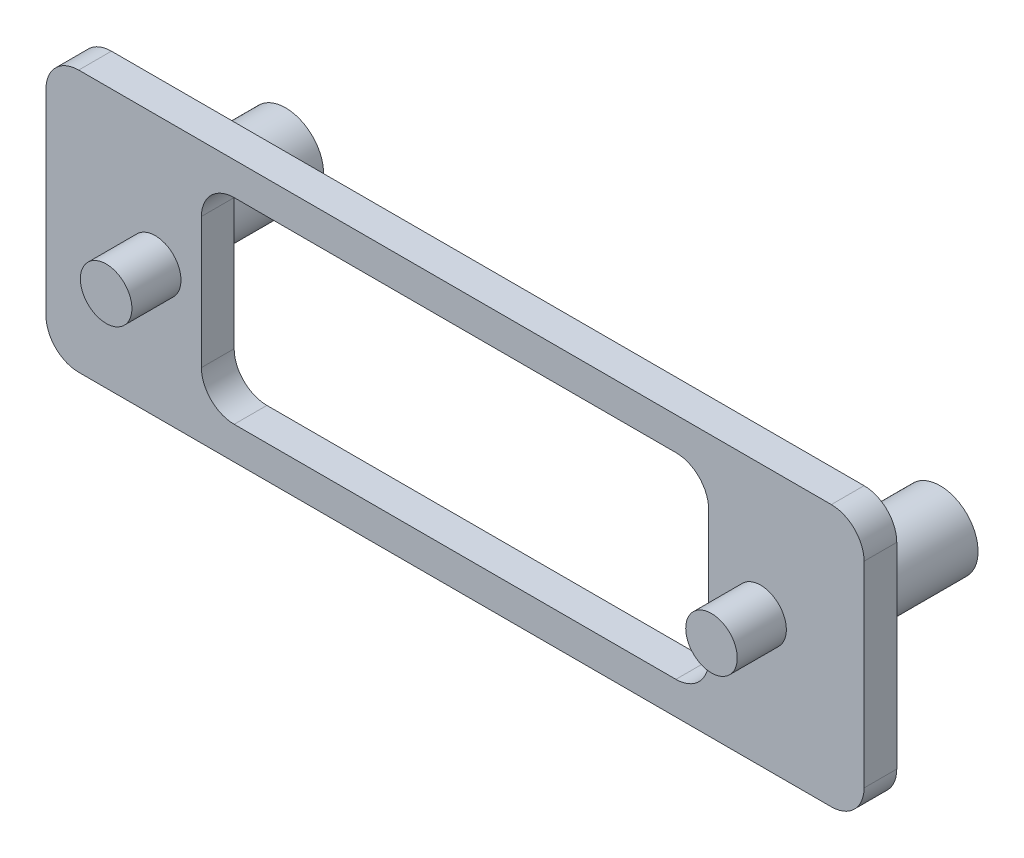
ISO-10303-21;
HEADER;
FILE_DESCRIPTION(('STEP AP214'),'2;1');
FILE_NAME('part.step','',(''),(''),'','','');
FILE_SCHEMA(('AUTOMOTIVE_DESIGN { 1 0 10303 214 1 1 1 1 }'));
ENDSEC;
DATA;
#1=APPLICATION_CONTEXT('core data for automotive mechanical design processes');
#2=APPLICATION_PROTOCOL_DEFINITION('international standard','automotive_design',2000,#1);
#3=PRODUCT_CONTEXT('',#1,'mechanical');
#4=PRODUCT('Part','Part','',(#3));
#5=PRODUCT_RELATED_PRODUCT_CATEGORY('part','',(#4));
#6=PRODUCT_DEFINITION_FORMATION('','',#4);
#7=PRODUCT_DEFINITION_CONTEXT('part definition',#1,'design');
#8=PRODUCT_DEFINITION('design','',#6,#7);
#9=PRODUCT_DEFINITION_SHAPE('','',#8);
#10=(LENGTH_UNIT() NAMED_UNIT(*) SI_UNIT(.MILLI.,.METRE.));
#11=(NAMED_UNIT(*) PLANE_ANGLE_UNIT() SI_UNIT($,.RADIAN.));
#12=(NAMED_UNIT(*) SI_UNIT($,.STERADIAN.) SOLID_ANGLE_UNIT());
#13=UNCERTAINTY_MEASURE_WITH_UNIT(LENGTH_MEASURE(1.E-05),#10,'distance_accuracy_value','');
#14=(GEOMETRIC_REPRESENTATION_CONTEXT(3) GLOBAL_UNCERTAINTY_ASSIGNED_CONTEXT((#13)) GLOBAL_UNIT_ASSIGNED_CONTEXT((#10,
#11,#12)) REPRESENTATION_CONTEXT('',''));
#15=CARTESIAN_POINT('',(0.,0.,0.));
#16=DIRECTION('',(0.,0.,1.));
#17=DIRECTION('',(1.,0.,0.));
#18=AXIS2_PLACEMENT_3D('',#15,#16,#17);
#19=CARTESIAN_POINT('',(0.,0.,2.));
#20=DIRECTION('',(1.,0.,0.));
#21=DIRECTION('',(0.,1.,0.));
#22=AXIS2_PLACEMENT_3D('',#19,#20,#21);
#23=PLANE('',#22);
#24=DIRECTION('',(0.,-1.,0.));
#25=VECTOR('',#24,1.);
#26=CARTESIAN_POINT('',(0.,0.,0.));
#27=LINE('',#26,#25);
#28=CARTESIAN_POINT('',(0.,14.,0.));
#29=VERTEX_POINT('',#28);
#30=CARTESIAN_POINT('',(0.,2.,0.));
#31=VERTEX_POINT('',#30);
#32=EDGE_CURVE('E385',#29,#31,#27,.T.);
#33=ORIENTED_EDGE('',*,*,#32,.T.);
#34=DIRECTION('',(0.,0.,-1.));
#35=VECTOR('',#34,1.);
#36=CARTESIAN_POINT('',(0.,2.,2.));
#37=LINE('',#36,#35);
#38=CARTESIAN_POINT('',(0.,2.,2.));
#39=VERTEX_POINT('',#38);
#40=EDGE_CURVE('E207',#31,#39,#37,.F.);
#41=ORIENTED_EDGE('',*,*,#40,.T.);
#42=DIRECTION('',(0.,-1.,0.));
#43=VECTOR('',#42,1.);
#44=CARTESIAN_POINT('',(0.,0.,2.));
#45=LINE('',#44,#43);
#46=CARTESIAN_POINT('',(0.,14.,2.));
#47=VERTEX_POINT('',#46);
#48=EDGE_CURVE('E242',#47,#39,#45,.T.);
#49=ORIENTED_EDGE('',*,*,#48,.F.);
#50=DIRECTION('',(0.,0.,-1.));
#51=VECTOR('',#50,1.);
#52=CARTESIAN_POINT('',(0.,14.,2.));
#53=LINE('',#52,#51);
#54=EDGE_CURVE('E204',#47,#29,#53,.T.);
#55=ORIENTED_EDGE('',*,*,#54,.T.);
#56=EDGE_LOOP('',(#33,#41,#49,#55));
#57=FACE_BOUND('',#56,.T.);
#58=ADVANCED_FACE('F32',(#57),#23,.F.);
#59=CARTESIAN_POINT('',(0.,0.,2.));
#60=DIRECTION('',(0.,1.,0.));
#61=DIRECTION('',(0.,0.,1.));
#62=AXIS2_PLACEMENT_3D('',#59,#60,#61);
#63=PLANE('',#62);
#64=DIRECTION('',(1.,0.,0.));
#65=VECTOR('',#64,1.);
#66=CARTESIAN_POINT('',(0.,0.,2.));
#67=LINE('',#66,#65);
#68=CARTESIAN_POINT('',(2.,0.,2.));
#69=VERTEX_POINT('',#68);
#70=CARTESIAN_POINT('',(48.,0.,2.));
#71=VERTEX_POINT('',#70);
#72=EDGE_CURVE('E234',#69,#71,#67,.T.);
#73=ORIENTED_EDGE('',*,*,#72,.F.);
#74=DIRECTION('',(0.,0.,-1.));
#75=VECTOR('',#74,1.);
#76=CARTESIAN_POINT('',(2.,0.,2.));
#77=LINE('',#76,#75);
#78=CARTESIAN_POINT('',(2.,0.,0.));
#79=VERTEX_POINT('',#78);
#80=EDGE_CURVE('E193',#69,#79,#77,.T.);
#81=ORIENTED_EDGE('',*,*,#80,.T.);
#82=DIRECTION('',(1.,0.,0.));
#83=VECTOR('',#82,1.);
#84=CARTESIAN_POINT('',(0.,0.,0.));
#85=LINE('',#84,#83);
#86=CARTESIAN_POINT('',(48.,0.,0.));
#87=VERTEX_POINT('',#86);
#88=EDGE_CURVE('E245',#79,#87,#85,.T.);
#89=ORIENTED_EDGE('',*,*,#88,.T.);
#90=DIRECTION('',(0.,0.,-1.));
#91=VECTOR('',#90,1.);
#92=CARTESIAN_POINT('',(48.,0.,2.));
#93=LINE('',#92,#91);
#94=EDGE_CURVE('E191',#87,#71,#93,.F.);
#95=ORIENTED_EDGE('',*,*,#94,.T.);
#96=EDGE_LOOP('',(#73,#81,#89,#95));
#97=FACE_BOUND('',#96,.T.);
#98=ADVANCED_FACE('F299',(#97),#63,.F.);
#99=CARTESIAN_POINT('',(50.,0.,2.));
#100=DIRECTION('',(-1.,0.,0.));
#101=DIRECTION('',(0.,-1.,0.));
#102=AXIS2_PLACEMENT_3D('',#99,#100,#101);
#103=PLANE('',#102);
#104=DIRECTION('',(0.,1.,0.));
#105=VECTOR('',#104,1.);
#106=CARTESIAN_POINT('',(50.,0.,2.));
#107=LINE('',#106,#105);
#108=CARTESIAN_POINT('',(50.,2.,2.));
#109=VERTEX_POINT('',#108);
#110=CARTESIAN_POINT('',(50.,14.,2.));
#111=VERTEX_POINT('',#110);
#112=EDGE_CURVE('E224',#109,#111,#107,.T.);
#113=ORIENTED_EDGE('',*,*,#112,.F.);
#114=DIRECTION('',(0.,0.,-1.));
#115=VECTOR('',#114,1.);
#116=CARTESIAN_POINT('',(50.,2.,2.));
#117=LINE('',#116,#115);
#118=CARTESIAN_POINT('',(50.,2.,0.));
#119=VERTEX_POINT('',#118);
#120=EDGE_CURVE('E11',#109,#119,#117,.T.);
#121=ORIENTED_EDGE('',*,*,#120,.T.);
#122=DIRECTION('',(0.,1.,0.));
#123=VECTOR('',#122,1.);
#124=CARTESIAN_POINT('',(50.,0.,0.));
#125=LINE('',#124,#123);
#126=CARTESIAN_POINT('',(50.,14.,0.));
#127=VERTEX_POINT('',#126);
#128=EDGE_CURVE('E227',#119,#127,#125,.T.);
#129=ORIENTED_EDGE('',*,*,#128,.T.);
#130=DIRECTION('',(0.,0.,-1.));
#131=VECTOR('',#130,1.);
#132=CARTESIAN_POINT('',(50.,14.,2.));
#133=LINE('',#132,#131);
#134=EDGE_CURVE('E40',#127,#111,#133,.F.);
#135=ORIENTED_EDGE('',*,*,#134,.T.);
#136=EDGE_LOOP('',(#113,#121,#129,#135));
#137=FACE_BOUND('',#136,.T.);
#138=ADVANCED_FACE('F223',(#137),#103,.F.);
#139=CARTESIAN_POINT('',(0.,16.,2.));
#140=DIRECTION('',(0.,-1.,0.));
#141=DIRECTION('',(0.,0.,-1.));
#142=AXIS2_PLACEMENT_3D('',#139,#140,#141);
#143=PLANE('',#142);
#144=DIRECTION('',(-1.,0.,0.));
#145=VECTOR('',#144,1.);
#146=CARTESIAN_POINT('',(0.,16.,0.));
#147=LINE('',#146,#145);
#148=CARTESIAN_POINT('',(48.,16.,0.));
#149=VERTEX_POINT('',#148);
#150=CARTESIAN_POINT('',(2.00000000000001,16.,0.));
#151=VERTEX_POINT('',#150);
#152=EDGE_CURVE('E239',#149,#151,#147,.T.);
#153=ORIENTED_EDGE('',*,*,#152,.T.);
#154=DIRECTION('',(0.,0.,-1.));
#155=VECTOR('',#154,1.);
#156=CARTESIAN_POINT('',(2.00000000000001,16.,2.));
#157=LINE('',#156,#155);
#158=CARTESIAN_POINT('',(2.00000000000001,16.,2.));
#159=VERTEX_POINT('',#158);
#160=EDGE_CURVE('E47',#151,#159,#157,.F.);
#161=ORIENTED_EDGE('',*,*,#160,.T.);
#162=DIRECTION('',(-1.,0.,0.));
#163=VECTOR('',#162,1.);
#164=CARTESIAN_POINT('',(0.,16.,2.));
#165=LINE('',#164,#163);
#166=CARTESIAN_POINT('',(48.,16.,2.));
#167=VERTEX_POINT('',#166);
#168=EDGE_CURVE('E233',#167,#159,#165,.T.);
#169=ORIENTED_EDGE('',*,*,#168,.F.);
#170=DIRECTION('',(0.,0.,-1.));
#171=VECTOR('',#170,1.);
#172=CARTESIAN_POINT('',(48.,16.,2.));
#173=LINE('',#172,#171);
#174=EDGE_CURVE('E216',#167,#149,#173,.T.);
#175=ORIENTED_EDGE('',*,*,#174,.T.);
#176=EDGE_LOOP('',(#153,#161,#169,#175));
#177=FACE_BOUND('',#176,.T.);
#178=ADVANCED_FACE('F238',(#177),#143,.F.);
#179=CARTESIAN_POINT('',(0.,0.,2.));
#180=DIRECTION('',(0.,0.,-1.));
#181=DIRECTION('',(-1.,0.,0.));
#182=AXIS2_PLACEMENT_3D('',#179,#180,#181);
#183=PLANE('',#182);
#184=DIRECTION('',(1.,0.,0.));
#185=VECTOR('',#184,1.);
#186=CARTESIAN_POINT('',(9.50000000000001,2.,2.));
#187=LINE('',#186,#185);
#188=CARTESIAN_POINT('',(11.5,2.,2.));
#189=VERTEX_POINT('',#188);
#190=CARTESIAN_POINT('',(38.5,2.,2.));
#191=VERTEX_POINT('',#190);
#192=EDGE_CURVE('E279',#189,#191,#187,.T.);
#193=ORIENTED_EDGE('',*,*,#192,.F.);
#194=CARTESIAN_POINT('',(11.5,4.,2.));
#195=DIRECTION('',(0.,0.,-1.));
#196=DIRECTION('',(-1.,0.,0.));
#197=AXIS2_PLACEMENT_3D('',#194,#195,#196);
#198=CIRCLE('',#197,2.);
#199=CARTESIAN_POINT('',(9.50000000000001,4.,2.));
#200=VERTEX_POINT('',#199);
#201=EDGE_CURVE('E178',#189,#200,#198,.T.);
#202=ORIENTED_EDGE('',*,*,#201,.T.);
#203=DIRECTION('',(0.,-1.,0.));
#204=VECTOR('',#203,1.);
#205=CARTESIAN_POINT('',(9.50000000000001,2.,2.));
#206=LINE('',#205,#204);
#207=CARTESIAN_POINT('',(9.50000000000001,12.,2.));
#208=VERTEX_POINT('',#207);
#209=EDGE_CURVE('E285',#208,#200,#206,.T.);
#210=ORIENTED_EDGE('',*,*,#209,.F.);
#211=CARTESIAN_POINT('',(11.5,12.,2.));
#212=DIRECTION('',(0.,0.,-1.));
#213=DIRECTION('',(-1.,0.,0.));
#214=AXIS2_PLACEMENT_3D('',#211,#212,#213);
#215=CIRCLE('',#214,2.);
#216=CARTESIAN_POINT('',(11.5,14.,2.));
#217=VERTEX_POINT('',#216);
#218=EDGE_CURVE('E187',#208,#217,#215,.T.);
#219=ORIENTED_EDGE('',*,*,#218,.T.);
#220=DIRECTION('',(-1.,0.,0.));
#221=VECTOR('',#220,1.);
#222=CARTESIAN_POINT('',(9.50000000000001,14.,2.));
#223=LINE('',#222,#221);
#224=CARTESIAN_POINT('',(38.5,14.,2.));
#225=VERTEX_POINT('',#224);
#226=EDGE_CURVE('E377',#225,#217,#223,.T.);
#227=ORIENTED_EDGE('',*,*,#226,.F.);
#228=CARTESIAN_POINT('',(38.5,12.,2.));
#229=DIRECTION('',(0.,0.,-1.));
#230=DIRECTION('',(-1.,0.,0.));
#231=AXIS2_PLACEMENT_3D('',#228,#229,#230);
#232=CIRCLE('',#231,2.);
#233=CARTESIAN_POINT('',(40.5,12.,2.));
#234=VERTEX_POINT('',#233);
#235=EDGE_CURVE('E179',#225,#234,#232,.T.);
#236=ORIENTED_EDGE('',*,*,#235,.T.);
#237=DIRECTION('',(0.,1.,0.));
#238=VECTOR('',#237,1.);
#239=CARTESIAN_POINT('',(40.5,2.,2.));
#240=LINE('',#239,#238);
#241=CARTESIAN_POINT('',(40.5,4.,2.));
#242=VERTEX_POINT('',#241);
#243=EDGE_CURVE('E155',#242,#234,#240,.T.);
#244=ORIENTED_EDGE('',*,*,#243,.F.);
#245=CARTESIAN_POINT('',(38.5,4.,2.));
#246=DIRECTION('',(0.,0.,-1.));
#247=DIRECTION('',(-1.,0.,0.));
#248=AXIS2_PLACEMENT_3D('',#245,#246,#247);
#249=CIRCLE('',#248,2.);
#250=EDGE_CURVE('E274',#242,#191,#249,.T.);
#251=ORIENTED_EDGE('',*,*,#250,.T.);
#252=EDGE_LOOP('',(#193,#202,#210,#219,#227,#236,#244,#251));
#253=FACE_BOUND('',#252,.T.);
#254=CARTESIAN_POINT('',(43.675,8.,2.));
#255=DIRECTION('',(0.,0.,-1.));
#256=DIRECTION('',(-1.,0.,0.));
#257=AXIS2_PLACEMENT_3D('',#254,#255,#256);
#258=CIRCLE('',#257,1.575);
#259=CARTESIAN_POINT('',(42.1,8.,2.));
#260=VERTEX_POINT('',#259);
#261=EDGE_CURVE('E252',#260,#260,#258,.F.);
#262=ORIENTED_EDGE('',*,*,#261,.F.);
#263=EDGE_LOOP('',(#262));
#264=FACE_BOUND('',#263,.T.);
#265=CARTESIAN_POINT('',(6.67500000000001,8.,2.));
#266=DIRECTION('',(0.,0.,-1.));
#267=DIRECTION('',(-1.,0.,0.));
#268=AXIS2_PLACEMENT_3D('',#265,#266,#267);
#269=CIRCLE('',#268,1.575);
#270=CARTESIAN_POINT('',(5.10000000000001,8.,2.));
#271=VERTEX_POINT('',#270);
#272=EDGE_CURVE('E249',#271,#271,#269,.F.);
#273=ORIENTED_EDGE('',*,*,#272,.F.);
#274=EDGE_LOOP('',(#273));
#275=FACE_BOUND('',#274,.T.);
#276=ORIENTED_EDGE('',*,*,#48,.T.);
#277=CARTESIAN_POINT('',(2.,2.,2.));
#278=DIRECTION('',(0.,0.,-1.));
#279=DIRECTION('',(-1.,0.,0.));
#280=AXIS2_PLACEMENT_3D('',#277,#278,#279);
#281=CIRCLE('',#280,2.);
#282=EDGE_CURVE('E214',#39,#69,#281,.F.);
#283=ORIENTED_EDGE('',*,*,#282,.T.);
#284=ORIENTED_EDGE('',*,*,#72,.T.);
#285=CARTESIAN_POINT('',(48.,2.,2.));
#286=DIRECTION('',(0.,0.,-1.));
#287=DIRECTION('',(-1.,0.,0.));
#288=AXIS2_PLACEMENT_3D('',#285,#286,#287);
#289=CIRCLE('',#288,2.);
#290=EDGE_CURVE('E210',#71,#109,#289,.F.);
#291=ORIENTED_EDGE('',*,*,#290,.T.);
#292=ORIENTED_EDGE('',*,*,#112,.T.);
#293=CARTESIAN_POINT('',(48.,14.,2.));
#294=DIRECTION('',(0.,0.,-1.));
#295=DIRECTION('',(-1.,0.,0.));
#296=AXIS2_PLACEMENT_3D('',#293,#294,#295);
#297=CIRCLE('',#296,2.);
#298=EDGE_CURVE('E54',#111,#167,#297,.F.);
#299=ORIENTED_EDGE('',*,*,#298,.T.);
#300=ORIENTED_EDGE('',*,*,#168,.T.);
#301=CARTESIAN_POINT('',(2.00000000000001,14.,2.));
#302=DIRECTION('',(0.,0.,-1.));
#303=DIRECTION('',(-1.,0.,0.));
#304=AXIS2_PLACEMENT_3D('',#301,#302,#303);
#305=CIRCLE('',#304,2.);
#306=EDGE_CURVE('E212',#159,#47,#305,.F.);
#307=ORIENTED_EDGE('',*,*,#306,.T.);
#308=EDGE_LOOP('',(#276,#283,#284,#291,#292,#299,#300,#307));
#309=FACE_BOUND('',#308,.T.);
#310=ADVANCED_FACE('F230',(#253,#264,#275,#309),#183,.F.);
#311=CARTESIAN_POINT('',(0.,0.,0.));
#312=DIRECTION('',(0.,0.,-1.));
#313=DIRECTION('',(-1.,0.,0.));
#314=AXIS2_PLACEMENT_3D('',#311,#312,#313);
#315=PLANE('',#314);
#316=CARTESIAN_POINT('',(4.64358902270783,8.,0.));
#317=DIRECTION('',(0.,0.,-1.));
#318=DIRECTION('',(-1.,0.,0.));
#319=AXIS2_PLACEMENT_3D('',#316,#317,#318);
#320=CIRCLE('',#319,2.325);
#321=CARTESIAN_POINT('',(2.31858902270783,8.,0.));
#322=VERTEX_POINT('',#321);
#323=EDGE_CURVE('E364',#322,#322,#320,.T.);
#324=ORIENTED_EDGE('',*,*,#323,.F.);
#325=EDGE_LOOP('',(#324));
#326=FACE_BOUND('',#325,.T.);
#327=CARTESIAN_POINT('',(44.6435890227078,8.,0.));
#328=DIRECTION('',(0.,0.,-1.));
#329=DIRECTION('',(-1.,0.,0.));
#330=AXIS2_PLACEMENT_3D('',#327,#328,#329);
#331=CIRCLE('',#330,2.325);
#332=CARTESIAN_POINT('',(42.3185890227078,8.,0.));
#333=VERTEX_POINT('',#332);
#334=EDGE_CURVE('E363',#333,#333,#331,.T.);
#335=ORIENTED_EDGE('',*,*,#334,.F.);
#336=EDGE_LOOP('',(#335));
#337=FACE_BOUND('',#336,.T.);
#338=DIRECTION('',(0.,1.,0.));
#339=VECTOR('',#338,1.);
#340=CARTESIAN_POINT('',(9.50000000000001,0.,0.));
#341=LINE('',#340,#339);
#342=CARTESIAN_POINT('',(9.50000000000001,4.,0.));
#343=VERTEX_POINT('',#342);
#344=CARTESIAN_POINT('',(9.50000000000001,12.,0.));
#345=VERTEX_POINT('',#344);
#346=EDGE_CURVE('E159',#343,#345,#341,.T.);
#347=ORIENTED_EDGE('',*,*,#346,.F.);
#348=CARTESIAN_POINT('',(11.5,4.,0.));
#349=DIRECTION('',(0.,0.,-1.));
#350=DIRECTION('',(-1.,0.,0.));
#351=AXIS2_PLACEMENT_3D('',#348,#349,#350);
#352=CIRCLE('',#351,2.);
#353=CARTESIAN_POINT('',(11.5,2.,0.));
#354=VERTEX_POINT('',#353);
#355=EDGE_CURVE('E181',#343,#354,#352,.F.);
#356=ORIENTED_EDGE('',*,*,#355,.T.);
#357=DIRECTION('',(-1.,0.,0.));
#358=VECTOR('',#357,1.);
#359=CARTESIAN_POINT('',(0.,2.,0.));
#360=LINE('',#359,#358);
#361=CARTESIAN_POINT('',(38.5,2.,0.));
#362=VERTEX_POINT('',#361);
#363=EDGE_CURVE('E172',#362,#354,#360,.T.);
#364=ORIENTED_EDGE('',*,*,#363,.F.);
#365=CARTESIAN_POINT('',(38.5,4.,0.));
#366=DIRECTION('',(0.,0.,-1.));
#367=DIRECTION('',(-1.,0.,0.));
#368=AXIS2_PLACEMENT_3D('',#365,#366,#367);
#369=CIRCLE('',#368,2.);
#370=CARTESIAN_POINT('',(40.5,4.,0.));
#371=VERTEX_POINT('',#370);
#372=EDGE_CURVE('E170',#362,#371,#369,.F.);
#373=ORIENTED_EDGE('',*,*,#372,.T.);
#374=DIRECTION('',(0.,-1.,0.));
#375=VECTOR('',#374,1.);
#376=CARTESIAN_POINT('',(40.5,0.,0.));
#377=LINE('',#376,#375);
#378=CARTESIAN_POINT('',(40.5,12.,0.));
#379=VERTEX_POINT('',#378);
#380=EDGE_CURVE('E152',#379,#371,#377,.T.);
#381=ORIENTED_EDGE('',*,*,#380,.F.);
#382=CARTESIAN_POINT('',(38.5,12.,0.));
#383=DIRECTION('',(0.,0.,-1.));
#384=DIRECTION('',(-1.,0.,0.));
#385=AXIS2_PLACEMENT_3D('',#382,#383,#384);
#386=CIRCLE('',#385,2.);
#387=CARTESIAN_POINT('',(38.5,14.,0.));
#388=VERTEX_POINT('',#387);
#389=EDGE_CURVE('E166',#379,#388,#386,.F.);
#390=ORIENTED_EDGE('',*,*,#389,.T.);
#391=DIRECTION('',(1.,0.,0.));
#392=VECTOR('',#391,1.);
#393=CARTESIAN_POINT('',(0.,14.,0.));
#394=LINE('',#393,#392);
#395=CARTESIAN_POINT('',(11.5,14.,0.));
#396=VERTEX_POINT('',#395);
#397=EDGE_CURVE('E171',#396,#388,#394,.T.);
#398=ORIENTED_EDGE('',*,*,#397,.F.);
#399=CARTESIAN_POINT('',(11.5,12.,0.));
#400=DIRECTION('',(0.,0.,-1.));
#401=DIRECTION('',(-1.,0.,0.));
#402=AXIS2_PLACEMENT_3D('',#399,#400,#401);
#403=CIRCLE('',#402,2.);
#404=EDGE_CURVE('E189',#396,#345,#403,.F.);
#405=ORIENTED_EDGE('',*,*,#404,.T.);
#406=EDGE_LOOP('',(#347,#356,#364,#373,#381,#390,#398,#405));
#407=FACE_BOUND('',#406,.T.);
#408=ORIENTED_EDGE('',*,*,#88,.F.);
#409=CARTESIAN_POINT('',(2.,2.,0.));
#410=DIRECTION('',(0.,0.,-1.));
#411=DIRECTION('',(-1.,0.,0.));
#412=AXIS2_PLACEMENT_3D('',#409,#410,#411);
#413=CIRCLE('',#412,2.);
#414=EDGE_CURVE('E202',#79,#31,#413,.T.);
#415=ORIENTED_EDGE('',*,*,#414,.T.);
#416=ORIENTED_EDGE('',*,*,#32,.F.);
#417=CARTESIAN_POINT('',(2.00000000000001,14.,0.));
#418=DIRECTION('',(0.,0.,-1.));
#419=DIRECTION('',(-1.,0.,0.));
#420=AXIS2_PLACEMENT_3D('',#417,#418,#419);
#421=CIRCLE('',#420,2.);
#422=EDGE_CURVE('E200',#29,#151,#421,.T.);
#423=ORIENTED_EDGE('',*,*,#422,.T.);
#424=ORIENTED_EDGE('',*,*,#152,.F.);
#425=CARTESIAN_POINT('',(48.,14.,0.));
#426=DIRECTION('',(0.,0.,-1.));
#427=DIRECTION('',(-1.,0.,0.));
#428=AXIS2_PLACEMENT_3D('',#425,#426,#427);
#429=CIRCLE('',#428,2.);
#430=EDGE_CURVE('E196',#149,#127,#429,.T.);
#431=ORIENTED_EDGE('',*,*,#430,.T.);
#432=ORIENTED_EDGE('',*,*,#128,.F.);
#433=CARTESIAN_POINT('',(48.,2.,0.));
#434=DIRECTION('',(0.,0.,-1.));
#435=DIRECTION('',(-1.,0.,0.));
#436=AXIS2_PLACEMENT_3D('',#433,#434,#435);
#437=CIRCLE('',#436,2.);
#438=EDGE_CURVE('E198',#119,#87,#437,.T.);
#439=ORIENTED_EDGE('',*,*,#438,.T.);
#440=EDGE_LOOP('',(#408,#415,#416,#423,#424,#431,#432,#439));
#441=FACE_BOUND('',#440,.T.);
#442=ADVANCED_FACE('F163',(#326,#337,#407,#441),#315,.T.);
#443=CARTESIAN_POINT('',(6.67500000000001,8.,4.99999999999999));
#444=DIRECTION('',(0.,0.,-1.));
#445=DIRECTION('',(-1.,0.,0.));
#446=AXIS2_PLACEMENT_3D('',#443,#444,#445);
#447=CYLINDRICAL_SURFACE('',#446,1.575);
#448=CARTESIAN_POINT('',(6.67500000000001,8.,4.99999999999999));
#449=DIRECTION('',(0.,0.,1.));
#450=DIRECTION('',(1.,0.,0.));
#451=AXIS2_PLACEMENT_3D('',#448,#449,#450);
#452=CIRCLE('',#451,1.575);
#453=CARTESIAN_POINT('',(8.25000000000001,8.,4.99999999999999));
#454=VERTEX_POINT('',#453);
#455=EDGE_CURVE('E383',#454,#454,#452,.T.);
#456=ORIENTED_EDGE('',*,*,#455,.F.);
#457=EDGE_LOOP('',(#456));
#458=FACE_BOUND('',#457,.T.);
#459=ORIENTED_EDGE('',*,*,#272,.T.);
#460=EDGE_LOOP('',(#459));
#461=FACE_BOUND('',#460,.T.);
#462=ADVANCED_FACE('F314',(#458,#461),#447,.T.);
#463=CARTESIAN_POINT('',(6.67500000000001,8.,4.99999999999999));
#464=DIRECTION('',(0.,0.,1.));
#465=DIRECTION('',(1.,0.,0.));
#466=AXIS2_PLACEMENT_3D('',#463,#464,#465);
#467=PLANE('',#466);
#468=ORIENTED_EDGE('',*,*,#455,.T.);
#469=EDGE_LOOP('',(#468));
#470=FACE_BOUND('',#469,.T.);
#471=ADVANCED_FACE('F320',(#470),#467,.T.);
#472=CARTESIAN_POINT('',(43.675,8.,4.99999999999999));
#473=DIRECTION('',(0.,0.,-1.));
#474=DIRECTION('',(-1.,0.,0.));
#475=AXIS2_PLACEMENT_3D('',#472,#473,#474);
#476=CYLINDRICAL_SURFACE('',#475,1.575);
#477=CARTESIAN_POINT('',(43.675,8.,4.99999999999999));
#478=DIRECTION('',(0.,0.,1.));
#479=DIRECTION('',(1.,0.,0.));
#480=AXIS2_PLACEMENT_3D('',#477,#478,#479);
#481=CIRCLE('',#480,1.575);
#482=CARTESIAN_POINT('',(45.25,8.,4.99999999999999));
#483=VERTEX_POINT('',#482);
#484=EDGE_CURVE('E380',#483,#483,#481,.T.);
#485=ORIENTED_EDGE('',*,*,#484,.F.);
#486=EDGE_LOOP('',(#485));
#487=FACE_BOUND('',#486,.T.);
#488=ORIENTED_EDGE('',*,*,#261,.T.);
#489=EDGE_LOOP('',(#488));
#490=FACE_BOUND('',#489,.T.);
#491=ADVANCED_FACE('F324',(#487,#490),#476,.T.);
#492=CARTESIAN_POINT('',(43.675,8.,4.99999999999999));
#493=DIRECTION('',(0.,0.,1.));
#494=DIRECTION('',(1.,0.,0.));
#495=AXIS2_PLACEMENT_3D('',#492,#493,#494);
#496=PLANE('',#495);
#497=ORIENTED_EDGE('',*,*,#484,.T.);
#498=EDGE_LOOP('',(#497));
#499=FACE_BOUND('',#498,.T.);
#500=ADVANCED_FACE('F328',(#499),#496,.T.);
#501=CARTESIAN_POINT('',(9.50000000000001,2.,-1.));
#502=DIRECTION('',(-1.,0.,0.));
#503=DIRECTION('',(0.,0.,1.));
#504=AXIS2_PLACEMENT_3D('',#501,#502,#503);
#505=PLANE('',#504);
#506=ORIENTED_EDGE('',*,*,#209,.T.);
#507=DIRECTION('',(0.,0.,1.));
#508=VECTOR('',#507,1.);
#509=CARTESIAN_POINT('',(9.50000000000001,4.,0.));
#510=LINE('',#509,#508);
#511=EDGE_CURVE('E272',#200,#343,#510,.F.);
#512=ORIENTED_EDGE('',*,*,#511,.T.);
#513=ORIENTED_EDGE('',*,*,#346,.T.);
#514=DIRECTION('',(0.,0.,1.));
#515=VECTOR('',#514,1.);
#516=CARTESIAN_POINT('',(9.50000000000001,12.,2.));
#517=LINE('',#516,#515);
#518=EDGE_CURVE('E269',#345,#208,#517,.T.);
#519=ORIENTED_EDGE('',*,*,#518,.T.);
#520=EDGE_LOOP('',(#506,#512,#513,#519));
#521=FACE_BOUND('',#520,.T.);
#522=ADVANCED_FACE('F332',(#521),#505,.F.);
#523=CARTESIAN_POINT('',(9.50000000000001,14.,-1.));
#524=DIRECTION('',(0.,1.,0.));
#525=DIRECTION('',(0.,0.,1.));
#526=AXIS2_PLACEMENT_3D('',#523,#524,#525);
#527=PLANE('',#526);
#528=ORIENTED_EDGE('',*,*,#397,.T.);
#529=DIRECTION('',(0.,0.,1.));
#530=VECTOR('',#529,1.);
#531=CARTESIAN_POINT('',(38.5,14.,2.));
#532=LINE('',#531,#530);
#533=EDGE_CURVE('E177',#388,#225,#532,.T.);
#534=ORIENTED_EDGE('',*,*,#533,.T.);
#535=ORIENTED_EDGE('',*,*,#226,.T.);
#536=DIRECTION('',(0.,0.,1.));
#537=VECTOR('',#536,1.);
#538=CARTESIAN_POINT('',(11.5,14.,0.));
#539=LINE('',#538,#537);
#540=EDGE_CURVE('E266',#217,#396,#539,.F.);
#541=ORIENTED_EDGE('',*,*,#540,.T.);
#542=EDGE_LOOP('',(#528,#534,#535,#541));
#543=FACE_BOUND('',#542,.T.);
#544=ADVANCED_FACE('F335',(#543),#527,.F.);
#545=CARTESIAN_POINT('',(40.5,2.,-1.));
#546=DIRECTION('',(1.,0.,0.));
#547=DIRECTION('',(0.,0.,-1.));
#548=AXIS2_PLACEMENT_3D('',#545,#546,#547);
#549=PLANE('',#548);
#550=ORIENTED_EDGE('',*,*,#380,.T.);
#551=DIRECTION('',(0.,0.,1.));
#552=VECTOR('',#551,1.);
#553=CARTESIAN_POINT('',(40.5,4.,2.));
#554=LINE('',#553,#552);
#555=EDGE_CURVE('E158',#371,#242,#554,.T.);
#556=ORIENTED_EDGE('',*,*,#555,.T.);
#557=ORIENTED_EDGE('',*,*,#243,.T.);
#558=DIRECTION('',(0.,0.,1.));
#559=VECTOR('',#558,1.);
#560=CARTESIAN_POINT('',(40.5,12.,0.));
#561=LINE('',#560,#559);
#562=EDGE_CURVE('E148',#234,#379,#561,.F.);
#563=ORIENTED_EDGE('',*,*,#562,.T.);
#564=EDGE_LOOP('',(#550,#556,#557,#563));
#565=FACE_BOUND('',#564,.T.);
#566=ADVANCED_FACE('F150',(#565),#549,.F.);
#567=CARTESIAN_POINT('',(9.50000000000001,2.,-1.));
#568=DIRECTION('',(0.,-1.,0.));
#569=DIRECTION('',(0.,0.,-1.));
#570=AXIS2_PLACEMENT_3D('',#567,#568,#569);
#571=PLANE('',#570);
#572=ORIENTED_EDGE('',*,*,#192,.T.);
#573=DIRECTION('',(0.,0.,1.));
#574=VECTOR('',#573,1.);
#575=CARTESIAN_POINT('',(38.5,2.,0.));
#576=LINE('',#575,#574);
#577=EDGE_CURVE('E264',#191,#362,#576,.F.);
#578=ORIENTED_EDGE('',*,*,#577,.T.);
#579=ORIENTED_EDGE('',*,*,#363,.T.);
#580=DIRECTION('',(0.,0.,1.));
#581=VECTOR('',#580,1.);
#582=CARTESIAN_POINT('',(11.5,2.,2.));
#583=LINE('',#582,#581);
#584=EDGE_CURVE('E261',#354,#189,#583,.T.);
#585=ORIENTED_EDGE('',*,*,#584,.T.);
#586=EDGE_LOOP('',(#572,#578,#579,#585));
#587=FACE_BOUND('',#586,.T.);
#588=ADVANCED_FACE('F283',(#587),#571,.F.);
#589=CARTESIAN_POINT('',(38.5,4.,-1.));
#590=DIRECTION('',(0.,0.,-1.));
#591=DIRECTION('',(-1.,0.,0.));
#592=AXIS2_PLACEMENT_3D('',#589,#590,#591);
#593=CYLINDRICAL_SURFACE('',#592,2.);
#594=ORIENTED_EDGE('',*,*,#372,.F.);
#595=ORIENTED_EDGE('',*,*,#577,.F.);
#596=ORIENTED_EDGE('',*,*,#250,.F.);
#597=ORIENTED_EDGE('',*,*,#555,.F.);
#598=EDGE_LOOP('',(#594,#595,#596,#597));
#599=FACE_BOUND('',#598,.T.);
#600=ADVANCED_FACE('F287',(#599),#593,.F.);
#601=CARTESIAN_POINT('',(38.5,12.,-1.));
#602=DIRECTION('',(0.,0.,-1.));
#603=DIRECTION('',(-1.,0.,0.));
#604=AXIS2_PLACEMENT_3D('',#601,#602,#603);
#605=CYLINDRICAL_SURFACE('',#604,2.);
#606=ORIENTED_EDGE('',*,*,#389,.F.);
#607=ORIENTED_EDGE('',*,*,#562,.F.);
#608=ORIENTED_EDGE('',*,*,#235,.F.);
#609=ORIENTED_EDGE('',*,*,#533,.F.);
#610=EDGE_LOOP('',(#606,#607,#608,#609));
#611=FACE_BOUND('',#610,.T.);
#612=ADVANCED_FACE('F175',(#611),#605,.F.);
#613=CARTESIAN_POINT('',(11.5,4.,-1.));
#614=DIRECTION('',(0.,0.,-1.));
#615=DIRECTION('',(-1.,0.,0.));
#616=AXIS2_PLACEMENT_3D('',#613,#614,#615);
#617=CYLINDRICAL_SURFACE('',#616,2.);
#618=ORIENTED_EDGE('',*,*,#355,.F.);
#619=ORIENTED_EDGE('',*,*,#511,.F.);
#620=ORIENTED_EDGE('',*,*,#201,.F.);
#621=ORIENTED_EDGE('',*,*,#584,.F.);
#622=EDGE_LOOP('',(#618,#619,#620,#621));
#623=FACE_BOUND('',#622,.T.);
#624=ADVANCED_FACE('F294',(#623),#617,.F.);
#625=CARTESIAN_POINT('',(11.5,12.,-1.));
#626=DIRECTION('',(0.,0.,-1.));
#627=DIRECTION('',(-1.,0.,0.));
#628=AXIS2_PLACEMENT_3D('',#625,#626,#627);
#629=CYLINDRICAL_SURFACE('',#628,2.);
#630=ORIENTED_EDGE('',*,*,#404,.F.);
#631=ORIENTED_EDGE('',*,*,#540,.F.);
#632=ORIENTED_EDGE('',*,*,#218,.F.);
#633=ORIENTED_EDGE('',*,*,#518,.F.);
#634=EDGE_LOOP('',(#630,#631,#632,#633));
#635=FACE_BOUND('',#634,.T.);
#636=ADVANCED_FACE('F407',(#635),#629,.F.);
#637=CARTESIAN_POINT('',(2.,2.,2.));
#638=DIRECTION('',(0.,0.,-1.));
#639=DIRECTION('',(-1.,0.,0.));
#640=AXIS2_PLACEMENT_3D('',#637,#638,#639);
#641=CYLINDRICAL_SURFACE('',#640,2.);
#642=ORIENTED_EDGE('',*,*,#282,.F.);
#643=ORIENTED_EDGE('',*,*,#40,.F.);
#644=ORIENTED_EDGE('',*,*,#414,.F.);
#645=ORIENTED_EDGE('',*,*,#80,.F.);
#646=EDGE_LOOP('',(#642,#643,#644,#645));
#647=FACE_BOUND('',#646,.T.);
#648=ADVANCED_FACE('F401',(#647),#641,.T.);
#649=CARTESIAN_POINT('',(2.00000000000001,14.,2.));
#650=DIRECTION('',(0.,0.,-1.));
#651=DIRECTION('',(-1.,0.,0.));
#652=AXIS2_PLACEMENT_3D('',#649,#650,#651);
#653=CYLINDRICAL_SURFACE('',#652,2.);
#654=ORIENTED_EDGE('',*,*,#306,.F.);
#655=ORIENTED_EDGE('',*,*,#160,.F.);
#656=ORIENTED_EDGE('',*,*,#422,.F.);
#657=ORIENTED_EDGE('',*,*,#54,.F.);
#658=EDGE_LOOP('',(#654,#655,#656,#657));
#659=FACE_BOUND('',#658,.T.);
#660=ADVANCED_FACE('F396',(#659),#653,.T.);
#661=CARTESIAN_POINT('',(48.,2.,2.));
#662=DIRECTION('',(0.,0.,-1.));
#663=DIRECTION('',(-1.,0.,0.));
#664=AXIS2_PLACEMENT_3D('',#661,#662,#663);
#665=CYLINDRICAL_SURFACE('',#664,2.);
#666=ORIENTED_EDGE('',*,*,#290,.F.);
#667=ORIENTED_EDGE('',*,*,#94,.F.);
#668=ORIENTED_EDGE('',*,*,#438,.F.);
#669=ORIENTED_EDGE('',*,*,#120,.F.);
#670=EDGE_LOOP('',(#666,#667,#668,#669));
#671=FACE_BOUND('',#670,.T.);
#672=ADVANCED_FACE('F394',(#671),#665,.T.);
#673=CARTESIAN_POINT('',(48.,14.,2.));
#674=DIRECTION('',(0.,0.,-1.));
#675=DIRECTION('',(-1.,0.,0.));
#676=AXIS2_PLACEMENT_3D('',#673,#674,#675);
#677=CYLINDRICAL_SURFACE('',#676,2.);
#678=ORIENTED_EDGE('',*,*,#298,.F.);
#679=ORIENTED_EDGE('',*,*,#134,.F.);
#680=ORIENTED_EDGE('',*,*,#430,.F.);
#681=ORIENTED_EDGE('',*,*,#174,.F.);
#682=EDGE_LOOP('',(#678,#679,#680,#681));
#683=FACE_BOUND('',#682,.T.);
#684=ADVANCED_FACE('F34',(#683),#677,.T.);
#685=CARTESIAN_POINT('',(44.6435890227078,8.,-8.));
#686=DIRECTION('',(0.,0.,1.));
#687=DIRECTION('',(1.,0.,0.));
#688=AXIS2_PLACEMENT_3D('',#685,#686,#687);
#689=CYLINDRICAL_SURFACE('',#688,2.325);
#690=CARTESIAN_POINT('',(44.6435890227078,8.,-8.));
#691=DIRECTION('',(0.,0.,-1.));
#692=DIRECTION('',(-1.,0.,0.));
#693=AXIS2_PLACEMENT_3D('',#690,#691,#692);
#694=CIRCLE('',#693,2.325);
#695=CARTESIAN_POINT('',(42.3185890227078,8.,-8.));
#696=VERTEX_POINT('',#695);
#697=EDGE_CURVE('E367',#696,#696,#694,.T.);
#698=ORIENTED_EDGE('',*,*,#697,.F.);
#699=EDGE_LOOP('',(#698));
#700=FACE_BOUND('',#699,.T.);
#701=ORIENTED_EDGE('',*,*,#334,.T.);
#702=EDGE_LOOP('',(#701));
#703=FACE_BOUND('',#702,.T.);
#704=ADVANCED_FACE('F343',(#700,#703),#689,.T.);
#705=CARTESIAN_POINT('',(44.6435890227078,8.,-8.));
#706=DIRECTION('',(0.,0.,-1.));
#707=DIRECTION('',(-1.,0.,0.));
#708=AXIS2_PLACEMENT_3D('',#705,#706,#707);
#709=PLANE('',#708);
#710=ORIENTED_EDGE('',*,*,#697,.T.);
#711=EDGE_LOOP('',(#710));
#712=FACE_BOUND('',#711,.T.);
#713=ADVANCED_FACE('F346',(#712),#709,.T.);
#714=CARTESIAN_POINT('',(4.64358902270783,8.,-8.));
#715=DIRECTION('',(0.,0.,1.));
#716=DIRECTION('',(1.,0.,0.));
#717=AXIS2_PLACEMENT_3D('',#714,#715,#716);
#718=CYLINDRICAL_SURFACE('',#717,2.325);
#719=CARTESIAN_POINT('',(4.64358902270783,8.,-8.));
#720=DIRECTION('',(0.,0.,-1.));
#721=DIRECTION('',(-1.,0.,0.));
#722=AXIS2_PLACEMENT_3D('',#719,#720,#721);
#723=CIRCLE('',#722,2.325);
#724=CARTESIAN_POINT('',(2.31858902270783,8.,-8.));
#725=VERTEX_POINT('',#724);
#726=EDGE_CURVE('E362',#725,#725,#723,.T.);
#727=ORIENTED_EDGE('',*,*,#726,.F.);
#728=EDGE_LOOP('',(#727));
#729=FACE_BOUND('',#728,.T.);
#730=ORIENTED_EDGE('',*,*,#323,.T.);
#731=EDGE_LOOP('',(#730));
#732=FACE_BOUND('',#731,.T.);
#733=ADVANCED_FACE('F350',(#729,#732),#718,.T.);
#734=CARTESIAN_POINT('',(4.64358902270783,8.,-8.));
#735=DIRECTION('',(0.,0.,-1.));
#736=DIRECTION('',(-1.,0.,0.));
#737=AXIS2_PLACEMENT_3D('',#734,#735,#736);
#738=PLANE('',#737);
#739=ORIENTED_EDGE('',*,*,#726,.T.);
#740=EDGE_LOOP('',(#739));
#741=FACE_BOUND('',#740,.T.);
#742=ADVANCED_FACE('F354',(#741),#738,.T.);
#743=CLOSED_SHELL('',(#58,#98,#138,#178,#310,#442,#462,#471,#491,#500,#522,#544,#566,#588,#600,
#612,#624,#636,#648,#660,#672,#684,#704,#713,#733,#742));
#744=MANIFOLD_SOLID_BREP('B2',#743);
#745=ADVANCED_BREP_SHAPE_REPRESENTATION('',(#18,#744),#14);
#746=SHAPE_DEFINITION_REPRESENTATION(#9,#745);
ENDSEC;
END-ISO-10303-21;
